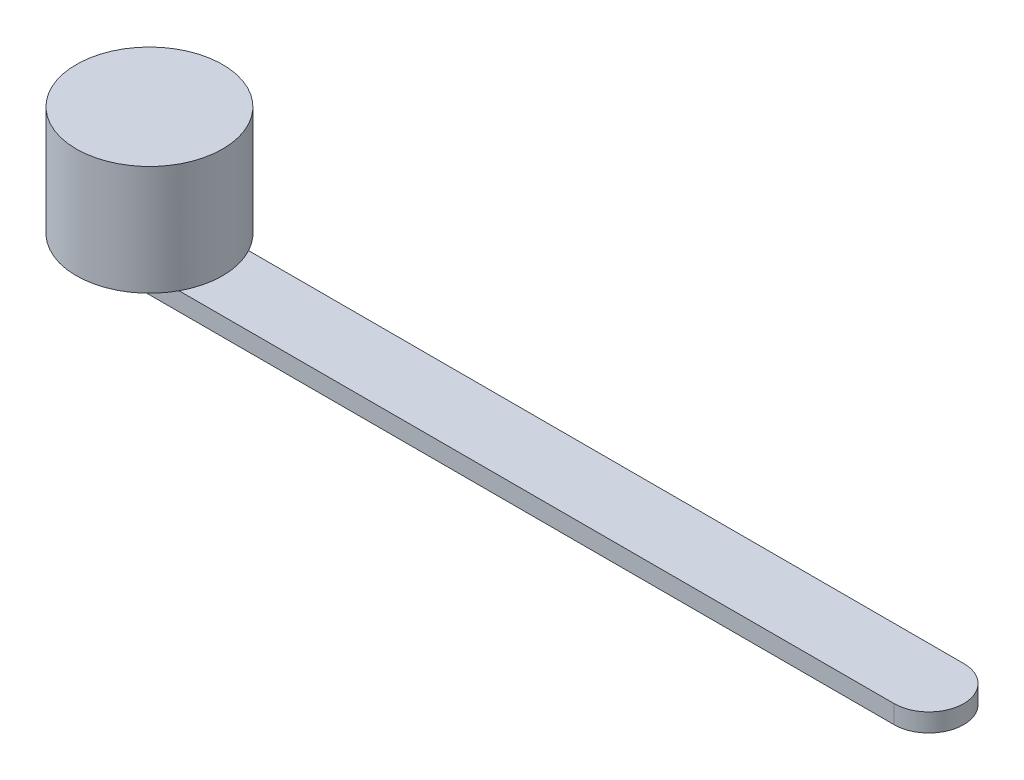
ISO-10303-21;
HEADER;
FILE_DESCRIPTION(('STEP AP214'),'2;1');
FILE_NAME('part.step','',(''),(''),'','','');
FILE_SCHEMA(('AUTOMOTIVE_DESIGN { 1 0 10303 214 1 1 1 1 }'));
ENDSEC;
DATA;
#1=APPLICATION_CONTEXT('core data for automotive mechanical design processes');
#2=APPLICATION_PROTOCOL_DEFINITION('international standard','automotive_design',2000,#1);
#3=PRODUCT_CONTEXT('',#1,'mechanical');
#4=PRODUCT('Part','Part','',(#3));
#5=PRODUCT_RELATED_PRODUCT_CATEGORY('part','',(#4));
#6=PRODUCT_DEFINITION_FORMATION('','',#4);
#7=PRODUCT_DEFINITION_CONTEXT('part definition',#1,'design');
#8=PRODUCT_DEFINITION('design','',#6,#7);
#9=PRODUCT_DEFINITION_SHAPE('','',#8);
#10=(LENGTH_UNIT() NAMED_UNIT(*) SI_UNIT(.MILLI.,.METRE.));
#11=(NAMED_UNIT(*) PLANE_ANGLE_UNIT() SI_UNIT($,.RADIAN.));
#12=(NAMED_UNIT(*) SI_UNIT($,.STERADIAN.) SOLID_ANGLE_UNIT());
#13=UNCERTAINTY_MEASURE_WITH_UNIT(LENGTH_MEASURE(1.E-05),#10,'distance_accuracy_value','');
#14=(GEOMETRIC_REPRESENTATION_CONTEXT(3) GLOBAL_UNCERTAINTY_ASSIGNED_CONTEXT((#13)) GLOBAL_UNIT_ASSIGNED_CONTEXT((#10,
#11,#12)) REPRESENTATION_CONTEXT('',''));
#15=CARTESIAN_POINT('',(0.,0.,0.));
#16=DIRECTION('',(0.,0.,1.));
#17=DIRECTION('',(1.,0.,0.));
#18=AXIS2_PLACEMENT_3D('',#15,#16,#17);
#19=CARTESIAN_POINT('',(-18.2954545454545,2.5,0.));
#20=DIRECTION('',(0.,1.,0.));
#21=DIRECTION('',(0.,0.,1.));
#22=AXIS2_PLACEMENT_3D('',#19,#20,#21);
#23=PLANE('',#22);
#24=CARTESIAN_POINT('',(-12.7954545454545,2.5,0.));
#25=DIRECTION('',(0.,1.,0.));
#26=DIRECTION('',(0.,0.,1.));
#27=AXIS2_PLACEMENT_3D('',#24,#25,#26);
#28=CIRCLE('',#27,10.);
#29=CARTESIAN_POINT('',(-3.99559659205552,2.5,4.75));
#30=VERTEX_POINT('',#29);
#31=CARTESIAN_POINT('',(-3.99559659205552,2.5,-4.75));
#32=VERTEX_POINT('',#31);
#33=EDGE_CURVE('E56',#30,#32,#28,.T.);
#34=ORIENTED_EDGE('',*,*,#33,.F.);
#35=DIRECTION('',(1.,0.,0.));
#36=VECTOR('',#35,1.);
#37=CARTESIAN_POINT('',(-18.2954545454545,2.5,4.75));
#38=LINE('',#37,#36);
#39=CARTESIAN_POINT('',(93.7045454545455,2.5,4.75));
#40=VERTEX_POINT('',#39);
#41=EDGE_CURVE('E135',#30,#40,#38,.T.);
#42=ORIENTED_EDGE('',*,*,#41,.T.);
#43=CARTESIAN_POINT('',(93.7045454545455,2.5,0.));
#44=DIRECTION('',(0.,1.,0.));
#45=DIRECTION('',(0.,0.,1.));
#46=AXIS2_PLACEMENT_3D('',#43,#44,#45);
#47=CIRCLE('',#46,4.75);
#48=CARTESIAN_POINT('',(93.7045454545455,2.5,-4.75));
#49=VERTEX_POINT('',#48);
#50=EDGE_CURVE('E138',#40,#49,#47,.T.);
#51=ORIENTED_EDGE('',*,*,#50,.T.);
#52=DIRECTION('',(1.,0.,0.));
#53=VECTOR('',#52,1.);
#54=CARTESIAN_POINT('',(-18.2954545454545,2.5,-4.75));
#55=LINE('',#54,#53);
#56=EDGE_CURVE('E64',#32,#49,#55,.T.);
#57=ORIENTED_EDGE('',*,*,#56,.F.);
#58=EDGE_LOOP('',(#34,#42,#51,#57));
#59=FACE_BOUND('',#58,.T.);
#60=ADVANCED_FACE('F45',(#59),#23,.T.);
#61=CARTESIAN_POINT('',(-18.2954545454545,2.5,0.));
#62=DIRECTION('',(0.,-1.,0.));
#63=DIRECTION('',(0.,0.,-1.));
#64=AXIS2_PLACEMENT_3D('',#61,#62,#63);
#65=CYLINDRICAL_SURFACE('',#64,4.75);
#66=CARTESIAN_POINT('',(-18.2954545454545,0.,0.));
#67=DIRECTION('',(0.,1.,0.));
#68=DIRECTION('',(0.,0.,1.));
#69=AXIS2_PLACEMENT_3D('',#66,#67,#68);
#70=CIRCLE('',#69,4.75);
#71=CARTESIAN_POINT('',(-18.2954545454545,0.,-4.75));
#72=VERTEX_POINT('',#71);
#73=CARTESIAN_POINT('',(-18.2954545454545,0.,4.75));
#74=VERTEX_POINT('',#73);
#75=EDGE_CURVE('E145',#72,#74,#70,.T.);
#76=ORIENTED_EDGE('',*,*,#75,.T.);
#77=DIRECTION('',(0.,-1.,0.));
#78=VECTOR('',#77,1.);
#79=CARTESIAN_POINT('',(-18.2954545454545,2.5,4.75));
#80=LINE('',#79,#78);
#81=CARTESIAN_POINT('',(-18.2954545454545,2.5,4.75));
#82=VERTEX_POINT('',#81);
#83=EDGE_CURVE('E49',#82,#74,#80,.T.);
#84=ORIENTED_EDGE('',*,*,#83,.F.);
#85=CARTESIAN_POINT('',(-18.2954545454545,2.5,0.));
#86=DIRECTION('',(0.,1.,0.));
#87=DIRECTION('',(0.,0.,1.));
#88=AXIS2_PLACEMENT_3D('',#85,#86,#87);
#89=CIRCLE('',#88,4.75);
#90=CARTESIAN_POINT('',(-22.5852272727273,2.5,2.03969359177969));
#91=VERTEX_POINT('',#90);
#92=EDGE_CURVE('E107',#91,#82,#89,.T.);
#93=ORIENTED_EDGE('',*,*,#92,.F.);
#94=CARTESIAN_POINT('',(-22.5852272727273,2.5,-2.03969359177969));
#95=VERTEX_POINT('',#94);
#96=EDGE_CURVE('E99',#95,#91,#89,.T.);
#97=ORIENTED_EDGE('',*,*,#96,.F.);
#98=CARTESIAN_POINT('',(-18.2954545454545,2.5,-4.75));
#99=VERTEX_POINT('',#98);
#100=EDGE_CURVE('E106',#99,#95,#89,.T.);
#101=ORIENTED_EDGE('',*,*,#100,.F.);
#102=DIRECTION('',(0.,-1.,0.));
#103=VECTOR('',#102,1.);
#104=CARTESIAN_POINT('',(-18.2954545454545,2.5,-4.75));
#105=LINE('',#104,#103);
#106=EDGE_CURVE('E144',#99,#72,#105,.T.);
#107=ORIENTED_EDGE('',*,*,#106,.T.);
#108=EDGE_LOOP('',(#76,#84,#93,#97,#101,#107));
#109=FACE_BOUND('',#108,.T.);
#110=ADVANCED_FACE('F47',(#109),#65,.T.);
#111=CARTESIAN_POINT('',(-18.2954545454545,2.5,4.75));
#112=DIRECTION('',(0.,0.,-1.));
#113=DIRECTION('',(-1.,0.,0.));
#114=AXIS2_PLACEMENT_3D('',#111,#112,#113);
#115=PLANE('',#114);
#116=DIRECTION('',(1.,0.,0.));
#117=VECTOR('',#116,1.);
#118=CARTESIAN_POINT('',(-18.2954545454545,0.,4.75));
#119=LINE('',#118,#117);
#120=CARTESIAN_POINT('',(93.7045454545455,0.,4.75));
#121=VERTEX_POINT('',#120);
#122=EDGE_CURVE('E148',#74,#121,#119,.T.);
#123=ORIENTED_EDGE('',*,*,#122,.T.);
#124=DIRECTION('',(0.,-1.,0.));
#125=VECTOR('',#124,1.);
#126=CARTESIAN_POINT('',(93.7045454545455,2.5,4.75));
#127=LINE('',#126,#125);
#128=EDGE_CURVE('E162',#40,#121,#127,.T.);
#129=ORIENTED_EDGE('',*,*,#128,.F.);
#130=ORIENTED_EDGE('',*,*,#41,.F.);
#131=EDGE_CURVE('E121',#82,#30,#38,.T.);
#132=ORIENTED_EDGE('',*,*,#131,.F.);
#133=ORIENTED_EDGE('',*,*,#83,.T.);
#134=EDGE_LOOP('',(#123,#129,#130,#132,#133));
#135=FACE_BOUND('',#134,.T.);
#136=ADVANCED_FACE('F171',(#135),#115,.F.);
#137=CARTESIAN_POINT('',(93.7045454545455,2.5,0.));
#138=DIRECTION('',(0.,-1.,0.));
#139=DIRECTION('',(0.,0.,-1.));
#140=AXIS2_PLACEMENT_3D('',#137,#138,#139);
#141=CYLINDRICAL_SURFACE('',#140,4.75);
#142=CARTESIAN_POINT('',(93.7045454545455,0.,0.));
#143=DIRECTION('',(0.,1.,0.));
#144=DIRECTION('',(0.,0.,1.));
#145=AXIS2_PLACEMENT_3D('',#142,#143,#144);
#146=CIRCLE('',#145,4.75);
#147=CARTESIAN_POINT('',(93.7045454545455,0.,-4.75));
#148=VERTEX_POINT('',#147);
#149=EDGE_CURVE('E151',#121,#148,#146,.T.);
#150=ORIENTED_EDGE('',*,*,#149,.T.);
#151=DIRECTION('',(0.,-1.,0.));
#152=VECTOR('',#151,1.);
#153=CARTESIAN_POINT('',(93.7045454545455,2.5,-4.75));
#154=LINE('',#153,#152);
#155=EDGE_CURVE('E160',#49,#148,#154,.T.);
#156=ORIENTED_EDGE('',*,*,#155,.F.);
#157=ORIENTED_EDGE('',*,*,#50,.F.);
#158=ORIENTED_EDGE('',*,*,#128,.T.);
#159=EDGE_LOOP('',(#150,#156,#157,#158));
#160=FACE_BOUND('',#159,.T.);
#161=ADVANCED_FACE('F179',(#160),#141,.T.);
#162=CARTESIAN_POINT('',(-18.2954545454545,2.5,-4.75));
#163=DIRECTION('',(0.,0.,-1.));
#164=DIRECTION('',(-1.,0.,0.));
#165=AXIS2_PLACEMENT_3D('',#162,#163,#164);
#166=PLANE('',#165);
#167=DIRECTION('',(1.,0.,0.));
#168=VECTOR('',#167,1.);
#169=CARTESIAN_POINT('',(-18.2954545454545,0.,-4.75));
#170=LINE('',#169,#168);
#171=EDGE_CURVE('E117',#72,#148,#170,.T.);
#172=ORIENTED_EDGE('',*,*,#171,.F.);
#173=ORIENTED_EDGE('',*,*,#106,.F.);
#174=EDGE_CURVE('E141',#99,#32,#55,.T.);
#175=ORIENTED_EDGE('',*,*,#174,.T.);
#176=ORIENTED_EDGE('',*,*,#56,.T.);
#177=ORIENTED_EDGE('',*,*,#155,.T.);
#178=EDGE_LOOP('',(#172,#173,#175,#176,#177));
#179=FACE_BOUND('',#178,.T.);
#180=ADVANCED_FACE('F177',(#179),#166,.T.);
#181=EDGE_CURVE('E11',#95,#91,#28,.T.);
#182=ORIENTED_EDGE('',*,*,#181,.F.);
#183=ORIENTED_EDGE('',*,*,#96,.T.);
#184=EDGE_LOOP('',(#182,#183));
#185=FACE_BOUND('',#184,.T.);
#186=ADVANCED_FACE('F101',(#185),#23,.T.);
#187=CARTESIAN_POINT('',(-18.2954545454545,0.,0.));
#188=DIRECTION('',(0.,1.,0.));
#189=DIRECTION('',(0.,0.,1.));
#190=AXIS2_PLACEMENT_3D('',#187,#188,#189);
#191=PLANE('',#190);
#192=ORIENTED_EDGE('',*,*,#75,.F.);
#193=ORIENTED_EDGE('',*,*,#171,.T.);
#194=ORIENTED_EDGE('',*,*,#149,.F.);
#195=ORIENTED_EDGE('',*,*,#122,.F.);
#196=EDGE_LOOP('',(#192,#193,#194,#195));
#197=FACE_BOUND('',#196,.T.);
#198=ADVANCED_FACE('F175',(#197),#191,.F.);
#199=CARTESIAN_POINT('',(-12.7954545454545,2.5,0.));
#200=DIRECTION('',(0.,1.,0.));
#201=DIRECTION('',(0.,0.,1.));
#202=AXIS2_PLACEMENT_3D('',#199,#200,#201);
#203=PLANE('',#202);
#204=EDGE_CURVE('E119',#91,#30,#28,.T.);
#205=ORIENTED_EDGE('',*,*,#204,.F.);
#206=ORIENTED_EDGE('',*,*,#92,.T.);
#207=ORIENTED_EDGE('',*,*,#131,.T.);
#208=EDGE_LOOP('',(#205,#206,#207));
#209=FACE_BOUND('',#208,.T.);
#210=ADVANCED_FACE('F120',(#209),#203,.F.);
#211=ORIENTED_EDGE('',*,*,#174,.F.);
#212=ORIENTED_EDGE('',*,*,#100,.T.);
#213=EDGE_CURVE('E57',#32,#95,#28,.T.);
#214=ORIENTED_EDGE('',*,*,#213,.F.);
#215=EDGE_LOOP('',(#211,#212,#214));
#216=FACE_BOUND('',#215,.T.);
#217=ADVANCED_FACE('F201',(#216),#203,.F.);
#218=CARTESIAN_POINT('',(-12.7954545454545,17.5,0.));
#219=DIRECTION('',(0.,-1.,0.));
#220=DIRECTION('',(0.,0.,-1.));
#221=AXIS2_PLACEMENT_3D('',#218,#219,#220);
#222=CYLINDRICAL_SURFACE('',#221,10.);
#223=CARTESIAN_POINT('',(-12.7954545454545,17.5,0.));
#224=DIRECTION('',(0.,1.,0.));
#225=DIRECTION('',(0.,0.,1.));
#226=AXIS2_PLACEMENT_3D('',#223,#224,#225);
#227=CIRCLE('',#226,10.);
#228=CARTESIAN_POINT('',(-12.7954545454545,17.5,10.));
#229=VERTEX_POINT('',#228);
#230=EDGE_CURVE('E131',#229,#229,#227,.T.);
#231=ORIENTED_EDGE('',*,*,#230,.F.);
#232=EDGE_LOOP('',(#231));
#233=FACE_BOUND('',#232,.T.);
#234=ORIENTED_EDGE('',*,*,#33,.T.);
#235=ORIENTED_EDGE('',*,*,#213,.T.);
#236=ORIENTED_EDGE('',*,*,#181,.T.);
#237=ORIENTED_EDGE('',*,*,#204,.T.);
#238=EDGE_LOOP('',(#234,#235,#236,#237));
#239=FACE_BOUND('',#238,.T.);
#240=ADVANCED_FACE('F125',(#233,#239),#222,.T.);
#241=CARTESIAN_POINT('',(-12.7954545454545,17.5,0.));
#242=DIRECTION('',(0.,1.,0.));
#243=DIRECTION('',(0.,0.,1.));
#244=AXIS2_PLACEMENT_3D('',#241,#242,#243);
#245=PLANE('',#244);
#246=ORIENTED_EDGE('',*,*,#230,.T.);
#247=EDGE_LOOP('',(#246));
#248=FACE_BOUND('',#247,.T.);
#249=ADVANCED_FACE('F207',(#248),#245,.T.);
#250=CLOSED_SHELL('',(#60,#110,#136,#161,#180,#186,#198,#210,#217,#240,#249));
#251=MANIFOLD_SOLID_BREP('B2',#250);
#252=ADVANCED_BREP_SHAPE_REPRESENTATION('',(#18,#251),#14);
#253=SHAPE_DEFINITION_REPRESENTATION(#9,#252);
ENDSEC;
END-ISO-10303-21;
